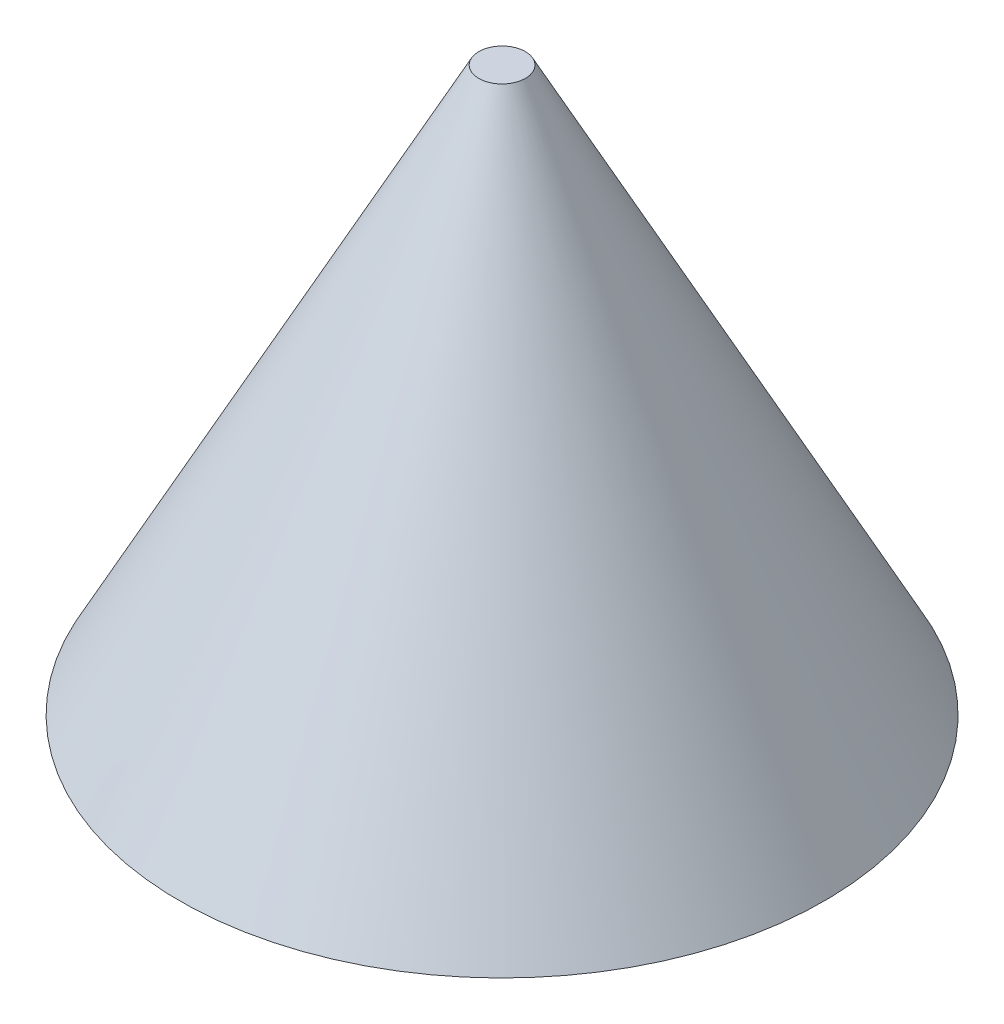
ISO-10303-21;
HEADER;
FILE_DESCRIPTION(('STEP AP214'),'2;1');
FILE_NAME('part.step','',(''),(''),'','','');
FILE_SCHEMA(('AUTOMOTIVE_DESIGN { 1 0 10303 214 1 1 1 1 }'));
ENDSEC;
DATA;
#1=APPLICATION_CONTEXT('core data for automotive mechanical design processes');
#2=APPLICATION_PROTOCOL_DEFINITION('international standard','automotive_design',2000,#1);
#3=PRODUCT_CONTEXT('',#1,'mechanical');
#4=PRODUCT('Part','Part','',(#3));
#5=PRODUCT_RELATED_PRODUCT_CATEGORY('part','',(#4));
#6=PRODUCT_DEFINITION_FORMATION('','',#4);
#7=PRODUCT_DEFINITION_CONTEXT('part definition',#1,'design');
#8=PRODUCT_DEFINITION('design','',#6,#7);
#9=PRODUCT_DEFINITION_SHAPE('','',#8);
#10=(LENGTH_UNIT() NAMED_UNIT(*) SI_UNIT(.MILLI.,.METRE.));
#11=(NAMED_UNIT(*) PLANE_ANGLE_UNIT() SI_UNIT($,.RADIAN.));
#12=(NAMED_UNIT(*) SI_UNIT($,.STERADIAN.) SOLID_ANGLE_UNIT());
#13=UNCERTAINTY_MEASURE_WITH_UNIT(LENGTH_MEASURE(1.E-05),#10,'distance_accuracy_value','');
#14=(GEOMETRIC_REPRESENTATION_CONTEXT(3) GLOBAL_UNCERTAINTY_ASSIGNED_CONTEXT((#13)) GLOBAL_UNIT_ASSIGNED_CONTEXT((#10,
#11,#12)) REPRESENTATION_CONTEXT('',''));
#15=CARTESIAN_POINT('',(0.,0.,0.));
#16=DIRECTION('',(0.,0.,1.));
#17=DIRECTION('',(1.,0.,0.));
#18=AXIS2_PLACEMENT_3D('',#15,#16,#17);
#19=CARTESIAN_POINT('',(25.,0.,0.));
#20=DIRECTION('',(0.,-1.,0.));
#21=DIRECTION('',(0.,0.,-1.));
#22=AXIS2_PLACEMENT_3D('',#19,#20,#21);
#23=PLANE('',#22);
#24=CARTESIAN_POINT('',(0.,0.,0.));
#25=DIRECTION('',(0.,-1.,0.));
#26=DIRECTION('',(0.,0.,-1.));
#27=AXIS2_PLACEMENT_3D('',#24,#25,#26);
#28=CIRCLE('',#27,25.);
#29=CARTESIAN_POINT('',(0.,0.,-25.));
#30=VERTEX_POINT('',#29);
#31=EDGE_CURVE('E64',#30,#30,#28,.T.);
#32=ORIENTED_EDGE('',*,*,#31,.T.);
#33=EDGE_LOOP('',(#32));
#34=FACE_BOUND('',#33,.T.);
#35=CARTESIAN_POINT('',(0.,0.,0.));
#36=DIRECTION('',(0.,-1.,0.));
#37=DIRECTION('',(0.,0.,-1.));
#38=AXIS2_PLACEMENT_3D('',#35,#36,#37);
#39=CIRCLE('',#38,21.);
#40=CARTESIAN_POINT('',(0.,0.,-21.));
#41=VERTEX_POINT('',#40);
#42=EDGE_CURVE('E11',#41,#41,#39,.T.);
#43=ORIENTED_EDGE('',*,*,#42,.F.);
#44=EDGE_LOOP('',(#43));
#45=FACE_BOUND('',#44,.T.);
#46=ADVANCED_FACE('F33',(#34,#45),#23,.T.);
#47=CARTESIAN_POINT('',(0.,0.,0.));
#48=DIRECTION('',(0.,-1.,0.));
#49=DIRECTION('',(0.,0.,-1.));
#50=AXIS2_PLACEMENT_3D('',#47,#48,#49);
#51=CYLINDRICAL_SURFACE('',#50,21.);
#52=ORIENTED_EDGE('',*,*,#42,.T.);
#53=EDGE_LOOP('',(#52));
#54=FACE_BOUND('',#53,.T.);
#55=CARTESIAN_POINT('',(0.,41.6157936991058,0.));
#56=DIRECTION('',(0.,-1.,0.));
#57=DIRECTION('',(0.,0.,-1.));
#58=AXIS2_PLACEMENT_3D('',#55,#56,#57);
#59=CIRCLE('',#58,21.);
#60=CARTESIAN_POINT('',(0.,41.6157936991058,-21.));
#61=VERTEX_POINT('',#60);
#62=EDGE_CURVE('E39',#61,#61,#59,.T.);
#63=ORIENTED_EDGE('',*,*,#62,.F.);
#64=EDGE_LOOP('',(#63));
#65=FACE_BOUND('',#64,.T.);
#66=ADVANCED_FACE('F45',(#54,#65),#51,.F.);
#67=CARTESIAN_POINT('',(0.,81.1110494713787,0.));
#68=DIRECTION('',(0.,-1.,0.));
#69=DIRECTION('',(0.,0.,-1.));
#70=AXIS2_PLACEMENT_3D('',#67,#68,#69);
#71=CONICAL_SURFACE('',#70,0.,0.488692190558413);
#72=ORIENTED_EDGE('',*,*,#62,.T.);
#73=EDGE_LOOP('',(#72));
#74=FACE_BOUND('',#73,.T.);
#75=CARTESIAN_POINT('',(0.,81.1110494713787,0.));
#76=VERTEX_POINT('',#75);
#77=VERTEX_LOOP('',#76);
#78=FACE_BOUND('',#77,.T.);
#79=ADVANCED_FACE('F42',(#74,#78),#71,.F.);
#80=CARTESIAN_POINT('',(3.,83.9890879480978,0.));
#81=DIRECTION('',(0.,1.,0.));
#82=DIRECTION('',(0.,0.,1.));
#83=AXIS2_PLACEMENT_3D('',#80,#81,#82);
#84=PLANE('',#83);
#85=CARTESIAN_POINT('',(0.,83.9890879480978,0.));
#86=DIRECTION('',(0.,-1.,0.));
#87=DIRECTION('',(0.,0.,-1.));
#88=AXIS2_PLACEMENT_3D('',#85,#86,#87);
#89=CIRCLE('',#88,3.);
#90=CARTESIAN_POINT('',(0.,83.9890879480978,-3.));
#91=VERTEX_POINT('',#90);
#92=EDGE_CURVE('E68',#91,#91,#89,.T.);
#93=ORIENTED_EDGE('',*,*,#92,.F.);
#94=EDGE_LOOP('',(#93));
#95=FACE_BOUND('',#94,.T.);
#96=ADVANCED_FACE('F44',(#95),#84,.T.);
#97=CARTESIAN_POINT('',(0.,11.4641808379398,0.));
#98=DIRECTION('',(0.,-1.,0.));
#99=DIRECTION('',(0.,0.,-1.));
#100=AXIS2_PLACEMENT_3D('',#97,#98,#99);
#101=CONICAL_SURFACE('',#100,41.5621771408438,0.488692190558413);
#102=CARTESIAN_POINT('',(0.,11.4641808379398,0.));
#103=DIRECTION('',(0.,-1.,0.));
#104=DIRECTION('',(0.,0.,-1.));
#105=AXIS2_PLACEMENT_3D('',#102,#103,#104);
#106=CIRCLE('',#105,41.5621771408438);
#107=CARTESIAN_POINT('',(0.,11.4641808379398,-41.5621771408438));
#108=VERTEX_POINT('',#107);
#109=EDGE_CURVE('E70',#108,#108,#106,.T.);
#110=CARTESIAN_POINT('',(0.,83.9890879480978,-3.));
#111=CARTESIAN_POINT('',(0.,83.2336201657003,-3.40168934521712));
#112=CARTESIAN_POINT('',(0.,82.4781523833028,-3.80337869043424));
#113=CARTESIAN_POINT('',(0.,80.9672168185079,-4.60675738086849));
#114=CARTESIAN_POINT('',(0.,80.2117490361104,-5.00844672608561));
#115=CARTESIAN_POINT('',(0.,78.7008134713154,-5.81182541651985));
#116=CARTESIAN_POINT('',(0.,77.945345688918,-6.21351476173697));
#117=CARTESIAN_POINT('',(0.,76.434410124123,-7.01689345217121));
#118=CARTESIAN_POINT('',(0.,75.6789423417255,-7.41858279738834));
#119=CARTESIAN_POINT('',(0.,74.1680067769306,-8.22196148782259));
#120=CARTESIAN_POINT('',(0.,73.4125389945331,-8.62365083303971));
#121=CARTESIAN_POINT('',(0.,71.9016034297381,-9.42702952347395));
#122=CARTESIAN_POINT('',(0.,71.1461356473406,-9.82871886869108));
#123=CARTESIAN_POINT('',(0.,69.6352000825457,-10.6320975591253));
#124=CARTESIAN_POINT('',(0.,68.8797323001482,-11.0337869043424));
#125=CARTESIAN_POINT('',(0.,67.3687967353532,-11.8371655947767));
#126=CARTESIAN_POINT('',(0.,66.6133289529558,-12.2388549399938));
#127=CARTESIAN_POINT('',(0.,65.1023933881608,-13.0422336304281));
#128=CARTESIAN_POINT('',(0.,64.3469256057633,-13.4439229756452));
#129=CARTESIAN_POINT('',(0.,62.8359900409684,-14.2473016660794));
#130=CARTESIAN_POINT('',(0.,62.0805222585709,-14.6489910112965));
#131=CARTESIAN_POINT('',(0.,60.5695866937759,-15.4523697017308));
#132=CARTESIAN_POINT('',(0.,59.8141189113784,-15.8540590469479));
#133=CARTESIAN_POINT('',(0.,58.3031833465835,-16.6574377373822));
#134=CARTESIAN_POINT('',(0.,57.547715564186,-17.0591270825993));
#135=CARTESIAN_POINT('',(0.,56.036779999391,-17.8625057730335));
#136=CARTESIAN_POINT('',(0.,55.2813122169936,-18.2641951182507));
#137=CARTESIAN_POINT('',(0.,53.7703766521986,-19.0675738086849));
#138=CARTESIAN_POINT('',(0.,53.0149088698011,-19.469263153902));
#139=CARTESIAN_POINT('',(0.,51.5039733050062,-20.2726418443363));
#140=CARTESIAN_POINT('',(0.,50.7485055226087,-20.6743311895534));
#141=CARTESIAN_POINT('',(0.,49.2375699578137,-21.4777098799876));
#142=CARTESIAN_POINT('',(0.,48.4821021754163,-21.8793992252048));
#143=CARTESIAN_POINT('',(0.,46.9711666106213,-22.682777915639));
#144=CARTESIAN_POINT('',(0.,46.2156988282238,-23.0844672608561));
#145=CARTESIAN_POINT('',(0.,44.7047632634289,-23.8878459512904));
#146=CARTESIAN_POINT('',(0.,43.9492954810314,-24.2895352965075));
#147=CARTESIAN_POINT('',(0.,42.4383599162364,-25.0929139869417));
#148=CARTESIAN_POINT('',(0.,41.6828921338389,-25.4946033321588));
#149=CARTESIAN_POINT('',(0.,40.171956569044,-26.2979820225931));
#150=CARTESIAN_POINT('',(0.,39.4164887866465,-26.6996713678102));
#151=CARTESIAN_POINT('',(0.,37.9055532218515,-27.5030500582445));
#152=CARTESIAN_POINT('',(0.,37.1500854394541,-27.9047394034616));
#153=CARTESIAN_POINT('',(0.,35.6391498746591,-28.7081180938958));
#154=CARTESIAN_POINT('',(0.,34.8836820922616,-29.109807439113));
#155=CARTESIAN_POINT('',(0.,33.3727465274667,-29.9131861295472));
#156=CARTESIAN_POINT('',(0.,32.6172787450692,-30.3148754747643));
#157=CARTESIAN_POINT('',(0.,31.1063431802742,-31.1182541651986));
#158=CARTESIAN_POINT('',(0.,30.3508753978767,-31.5199435104157));
#159=CARTESIAN_POINT('',(0.,28.8399398330818,-32.3233222008499));
#160=CARTESIAN_POINT('',(0.,28.0844720506843,-32.7250115460671));
#161=CARTESIAN_POINT('',(0.,26.5735364858893,-33.5283902365013));
#162=CARTESIAN_POINT('',(0.,25.8180687034919,-33.9300795817184));
#163=CARTESIAN_POINT('',(0.,24.3071331386969,-34.7334582721527));
#164=CARTESIAN_POINT('',(0.,23.5516653562994,-35.1351476173698));
#165=CARTESIAN_POINT('',(0.,22.0407297915045,-35.938526307804));
#166=CARTESIAN_POINT('',(0.,21.285262009107,-36.3402156530212));
#167=CARTESIAN_POINT('',(0.,19.774326444312,-37.1435943434554));
#168=CARTESIAN_POINT('',(0.,19.0188586619146,-37.5452836886725));
#169=CARTESIAN_POINT('',(0.,17.5079230971196,-38.3486623791068));
#170=CARTESIAN_POINT('',(0.,16.7524553147221,-38.7503517243239));
#171=CARTESIAN_POINT('',(0.,15.2415197499272,-39.5537304147581));
#172=CARTESIAN_POINT('',(0.,14.4860519675297,-39.9554197599753));
#173=CARTESIAN_POINT('',(0.,12.9751164027347,-40.7587984504095));
#174=CARTESIAN_POINT('',(0.,12.2196486203372,-41.1604877956266));
#175=CARTESIAN_POINT('',(0.,11.4641808379398,-41.5621771408438));
#176=B_SPLINE_CURVE_WITH_KNOTS('',3,(#110,#111,#112,#113,#114,#115,#116,#117,#118,#119,#120,
#121,#122,#123,#124,#125,#126,#127,#128,#129,#130,#131,#132,#133,#134,#135,#136,#137,#138,#139,
#140,#141,#142,#143,#144,#145,#146,#147,#148,#149,#150,#151,#152,#153,#154,#155,#156,#157,#158,
#159,#160,#161,#162,#163,#164,#165,#166,#167,#168,#169,#170,#171,#172,#173,#174,#175),
.UNSPECIFIED.,.F.,.F.,(4,2,2,2,2,2,2,2,2,2,2,2,2,2,2,2,2,2,2,2,2,2,2,2,2,2,2,2,2,2,2,2,4),(0.,
2.56686055381155,5.1337211076231,7.70058166143464,10.2674422152462,12.8343027690578,
15.4011633228693,17.9680238766808,20.5348844304924,23.1017449843039,25.6686055381155,
28.235466091927,30.8023266457386,33.3691871995501,35.9360477533617,38.5029083071732,
41.0697688609848,43.6366294147963,46.2034899686079,48.7703505224194,51.337211076231,
53.9040716300425,56.4709321838541,59.0377927376656,61.6046532914772,64.1715138452887,
66.7383743991003,69.3052349529118,71.8720955067234,74.4389560605349,77.0058166143465,
79.572677168158,82.1395377219696),.UNSPECIFIED.);
#177=EDGE_CURVE('BSEAM52',#91,#108,#176,.T.);
#178=ORIENTED_EDGE('',*,*,#92,.T.);
#179=ORIENTED_EDGE('',*,*,#109,.F.);
#180=ORIENTED_EDGE('',*,*,#177,.T.);
#181=ORIENTED_EDGE('',*,*,#177,.F.);
#182=EDGE_LOOP('',(#178,#180,#179,#181));
#183=FACE_BOUND('',#182,.T.);
#184=ADVANCED_FACE('F52',(#183),#101,.T.);
#185=CARTESIAN_POINT('',(41.5621771408438,11.4641808379398,0.));
#186=DIRECTION('',(0.,-1.,0.));
#187=DIRECTION('',(0.,0.,-1.));
#188=AXIS2_PLACEMENT_3D('',#185,#186,#187);
#189=PLANE('',#188);
#190=ORIENTED_EDGE('',*,*,#109,.T.);
#191=EDGE_LOOP('',(#190));
#192=FACE_BOUND('',#191,.T.);
#193=CARTESIAN_POINT('',(0.,11.4641808379398,0.));
#194=DIRECTION('',(0.,-1.,0.));
#195=DIRECTION('',(0.,0.,-1.));
#196=AXIS2_PLACEMENT_3D('',#193,#194,#195);
#197=CIRCLE('',#196,37.0318969380876);
#198=CARTESIAN_POINT('',(0.,11.4641808379398,-37.0318969380876));
#199=VERTEX_POINT('',#198);
#200=EDGE_CURVE('E75',#199,#199,#197,.T.);
#201=ORIENTED_EDGE('',*,*,#200,.F.);
#202=EDGE_LOOP('',(#201));
#203=FACE_BOUND('',#202,.T.);
#204=ADVANCED_FACE('F99',(#192,#203),#189,.T.);
#205=CARTESIAN_POINT('',(0.,20.,0.));
#206=DIRECTION('',(0.,-1.,0.));
#207=DIRECTION('',(0.,0.,-1.));
#208=AXIS2_PLACEMENT_3D('',#205,#206,#207);
#209=CONICAL_SURFACE('',#208,32.4933213826634,0.488692190558413);
#210=ORIENTED_EDGE('',*,*,#200,.T.);
#211=EDGE_LOOP('',(#210));
#212=FACE_BOUND('',#211,.T.);
#213=CARTESIAN_POINT('',(0.,20.,0.));
#214=DIRECTION('',(0.,-1.,0.));
#215=DIRECTION('',(0.,0.,-1.));
#216=AXIS2_PLACEMENT_3D('',#213,#214,#215);
#217=CIRCLE('',#216,32.4933213826634);
#218=CARTESIAN_POINT('',(0.,20.,-32.4933213826634));
#219=VERTEX_POINT('',#218);
#220=EDGE_CURVE('E78',#219,#219,#217,.T.);
#221=ORIENTED_EDGE('',*,*,#220,.F.);
#222=EDGE_LOOP('',(#221));
#223=FACE_BOUND('',#222,.T.);
#224=ADVANCED_FACE('F91',(#212,#223),#209,.F.);
#225=CARTESIAN_POINT('',(32.4933213826634,20.,0.));
#226=DIRECTION('',(0.,-1.,0.));
#227=DIRECTION('',(0.,0.,-1.));
#228=AXIS2_PLACEMENT_3D('',#225,#226,#227);
#229=PLANE('',#228);
#230=ORIENTED_EDGE('',*,*,#220,.T.);
#231=EDGE_LOOP('',(#230));
#232=FACE_BOUND('',#231,.T.);
#233=CARTESIAN_POINT('',(0.,20.,0.));
#234=DIRECTION('',(0.,-1.,0.));
#235=DIRECTION('',(0.,0.,-1.));
#236=AXIS2_PLACEMENT_3D('',#233,#234,#235);
#237=CIRCLE('',#236,25.);
#238=CARTESIAN_POINT('',(0.,20.,-25.));
#239=VERTEX_POINT('',#238);
#240=EDGE_CURVE('E81',#239,#239,#237,.T.);
#241=ORIENTED_EDGE('',*,*,#240,.F.);
#242=EDGE_LOOP('',(#241));
#243=FACE_BOUND('',#242,.T.);
#244=ADVANCED_FACE('F89',(#232,#243),#229,.T.);
#245=CARTESIAN_POINT('',(0.,0.,0.));
#246=DIRECTION('',(0.,-1.,0.));
#247=DIRECTION('',(0.,0.,-1.));
#248=AXIS2_PLACEMENT_3D('',#245,#246,#247);
#249=CYLINDRICAL_SURFACE('',#248,25.);
#250=ORIENTED_EDGE('',*,*,#240,.T.);
#251=EDGE_LOOP('',(#250));
#252=FACE_BOUND('',#251,.T.);
#253=ORIENTED_EDGE('',*,*,#31,.F.);
#254=EDGE_LOOP('',(#253));
#255=FACE_BOUND('',#254,.T.);
#256=ADVANCED_FACE('F86',(#252,#255),#249,.T.);
#257=CLOSED_SHELL('',(#46,#66,#79,#96,#184,#204,#224,#244,#256));
#258=MANIFOLD_SOLID_BREP('B2',#257);
#259=ADVANCED_BREP_SHAPE_REPRESENTATION('',(#18,#258),#14);
#260=SHAPE_DEFINITION_REPRESENTATION(#9,#259);
ENDSEC;
END-ISO-10303-21;
